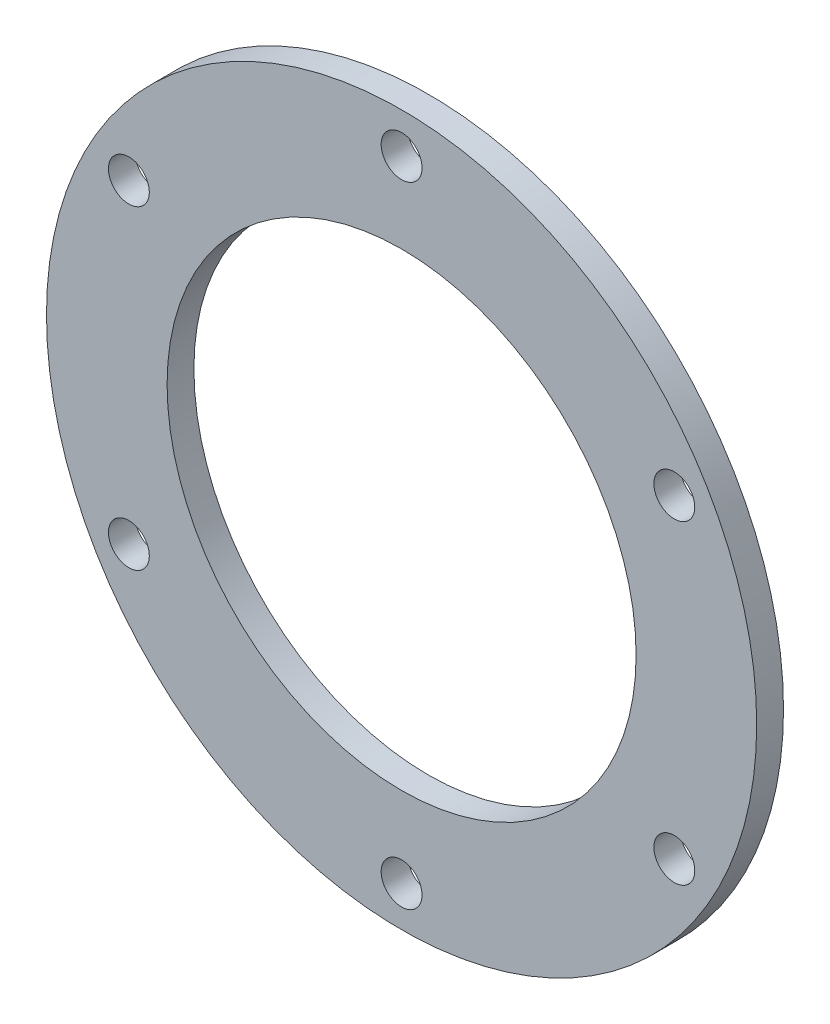
ISO-10303-21;
HEADER;
FILE_DESCRIPTION(('STEP AP214'),'2;1');
FILE_NAME('part.step','',(''),(''),'','','');
FILE_SCHEMA(('AUTOMOTIVE_DESIGN { 1 0 10303 214 1 1 1 1 }'));
ENDSEC;
DATA;
#1=APPLICATION_CONTEXT('core data for automotive mechanical design processes');
#2=APPLICATION_PROTOCOL_DEFINITION('international standard','automotive_design',2000,#1);
#3=PRODUCT_CONTEXT('',#1,'mechanical');
#4=PRODUCT('Part','Part','',(#3));
#5=PRODUCT_RELATED_PRODUCT_CATEGORY('part','',(#4));
#6=PRODUCT_DEFINITION_FORMATION('','',#4);
#7=PRODUCT_DEFINITION_CONTEXT('part definition',#1,'design');
#8=PRODUCT_DEFINITION('design','',#6,#7);
#9=PRODUCT_DEFINITION_SHAPE('','',#8);
#10=(LENGTH_UNIT() NAMED_UNIT(*) SI_UNIT(.MILLI.,.METRE.));
#11=(NAMED_UNIT(*) PLANE_ANGLE_UNIT() SI_UNIT($,.RADIAN.));
#12=(NAMED_UNIT(*) SI_UNIT($,.STERADIAN.) SOLID_ANGLE_UNIT());
#13=UNCERTAINTY_MEASURE_WITH_UNIT(LENGTH_MEASURE(1.E-05),#10,'distance_accuracy_value','');
#14=(GEOMETRIC_REPRESENTATION_CONTEXT(3) GLOBAL_UNCERTAINTY_ASSIGNED_CONTEXT((#13)) GLOBAL_UNIT_ASSIGNED_CONTEXT((#10,
#11,#12)) REPRESENTATION_CONTEXT('',''));
#15=CARTESIAN_POINT('',(0.,0.,0.));
#16=DIRECTION('',(0.,0.,1.));
#17=DIRECTION('',(1.,0.,0.));
#18=AXIS2_PLACEMENT_3D('',#15,#16,#17);
#19=CARTESIAN_POINT('',(0.,0.,2.));
#20=DIRECTION('',(0.,0.,1.));
#21=DIRECTION('',(1.,0.,0.));
#22=AXIS2_PLACEMENT_3D('',#19,#20,#21);
#23=PLANE('',#22);
#24=CARTESIAN_POINT('',(0.,23.5,2.));
#25=DIRECTION('',(0.,0.,1.));
#26=DIRECTION('',(1.,0.,0.));
#27=AXIS2_PLACEMENT_3D('',#24,#25,#26);
#28=CIRCLE('',#27,1.525);
#29=CARTESIAN_POINT('',(1.525,23.5,2.));
#30=VERTEX_POINT('',#29);
#31=EDGE_CURVE('E78',#30,#30,#28,.T.);
#32=ORIENTED_EDGE('',*,*,#31,.F.);
#33=EDGE_LOOP('',(#32));
#34=FACE_BOUND('',#33,.T.);
#35=CARTESIAN_POINT('',(-20.3515969889343,11.75,2.));
#36=DIRECTION('',(0.,0.,1.));
#37=DIRECTION('',(1.,0.,0.));
#38=AXIS2_PLACEMENT_3D('',#35,#36,#37);
#39=CIRCLE('',#38,1.525);
#40=CARTESIAN_POINT('',(-18.8265969889343,11.75,2.));
#41=VERTEX_POINT('',#40);
#42=EDGE_CURVE('E79',#41,#41,#39,.T.);
#43=ORIENTED_EDGE('',*,*,#42,.F.);
#44=EDGE_LOOP('',(#43));
#45=FACE_BOUND('',#44,.T.);
#46=CARTESIAN_POINT('',(-20.3515969889343,-11.75,2.));
#47=DIRECTION('',(0.,0.,1.));
#48=DIRECTION('',(1.,0.,0.));
#49=AXIS2_PLACEMENT_3D('',#46,#47,#48);
#50=CIRCLE('',#49,1.525);
#51=CARTESIAN_POINT('',(-18.8265969889343,-11.75,2.));
#52=VERTEX_POINT('',#51);
#53=EDGE_CURVE('E53',#52,#52,#50,.T.);
#54=ORIENTED_EDGE('',*,*,#53,.F.);
#55=EDGE_LOOP('',(#54));
#56=FACE_BOUND('',#55,.T.);
#57=CARTESIAN_POINT('',(0.,-23.5,2.));
#58=DIRECTION('',(0.,0.,1.));
#59=DIRECTION('',(1.,0.,0.));
#60=AXIS2_PLACEMENT_3D('',#57,#58,#59);
#61=CIRCLE('',#60,1.525);
#62=CARTESIAN_POINT('',(1.525,-23.5,2.));
#63=VERTEX_POINT('',#62);
#64=EDGE_CURVE('E60',#63,#63,#61,.T.);
#65=ORIENTED_EDGE('',*,*,#64,.F.);
#66=EDGE_LOOP('',(#65));
#67=FACE_BOUND('',#66,.T.);
#68=CARTESIAN_POINT('',(20.3515969889343,-11.75,2.));
#69=DIRECTION('',(0.,0.,1.));
#70=DIRECTION('',(1.,0.,0.));
#71=AXIS2_PLACEMENT_3D('',#68,#69,#70);
#72=CIRCLE('',#71,1.525);
#73=CARTESIAN_POINT('',(21.8765969889343,-11.75,2.));
#74=VERTEX_POINT('',#73);
#75=EDGE_CURVE('E66',#74,#74,#72,.T.);
#76=ORIENTED_EDGE('',*,*,#75,.F.);
#77=EDGE_LOOP('',(#76));
#78=FACE_BOUND('',#77,.T.);
#79=CARTESIAN_POINT('',(20.3515969889343,11.75,2.));
#80=DIRECTION('',(0.,0.,1.));
#81=DIRECTION('',(1.,0.,0.));
#82=AXIS2_PLACEMENT_3D('',#79,#80,#81);
#83=CIRCLE('',#82,1.525);
#84=CARTESIAN_POINT('',(21.8765969889343,11.75,2.));
#85=VERTEX_POINT('',#84);
#86=EDGE_CURVE('E72',#85,#85,#83,.T.);
#87=ORIENTED_EDGE('',*,*,#86,.F.);
#88=EDGE_LOOP('',(#87));
#89=FACE_BOUND('',#88,.T.);
#90=CARTESIAN_POINT('',(0.,0.,2.));
#91=DIRECTION('',(0.,0.,1.));
#92=DIRECTION('',(1.,0.,0.));
#93=AXIS2_PLACEMENT_3D('',#90,#91,#92);
#94=CIRCLE('',#93,26.5);
#95=CARTESIAN_POINT('',(26.5,0.,2.));
#96=VERTEX_POINT('',#95);
#97=EDGE_CURVE('E10',#96,#96,#94,.T.);
#98=ORIENTED_EDGE('',*,*,#97,.T.);
#99=EDGE_LOOP('',(#98));
#100=FACE_BOUND('',#99,.T.);
#101=CARTESIAN_POINT('',(0.,0.,2.));
#102=DIRECTION('',(0.,0.,1.));
#103=DIRECTION('',(1.,0.,0.));
#104=AXIS2_PLACEMENT_3D('',#101,#102,#103);
#105=CIRCLE('',#104,17.5);
#106=CARTESIAN_POINT('',(17.5,0.,2.));
#107=VERTEX_POINT('',#106);
#108=EDGE_CURVE('E45',#107,#107,#105,.T.);
#109=ORIENTED_EDGE('',*,*,#108,.F.);
#110=EDGE_LOOP('',(#109));
#111=FACE_BOUND('',#110,.T.);
#112=ADVANCED_FACE('F34',(#34,#45,#56,#67,#78,#89,#100,#111),#23,.T.);
#113=CARTESIAN_POINT('',(0.,0.,0.));
#114=DIRECTION('',(0.,0.,1.));
#115=DIRECTION('',(1.,0.,0.));
#116=AXIS2_PLACEMENT_3D('',#113,#114,#115);
#117=PLANE('',#116);
#118=CARTESIAN_POINT('',(0.,23.5,0.));
#119=DIRECTION('',(0.,0.,1.));
#120=DIRECTION('',(1.,0.,0.));
#121=AXIS2_PLACEMENT_3D('',#118,#119,#120);
#122=CIRCLE('',#121,1.525);
#123=CARTESIAN_POINT('',(1.525,23.5,0.));
#124=VERTEX_POINT('',#123);
#125=EDGE_CURVE('E50',#124,#124,#122,.T.);
#126=ORIENTED_EDGE('',*,*,#125,.T.);
#127=EDGE_LOOP('',(#126));
#128=FACE_BOUND('',#127,.T.);
#129=CARTESIAN_POINT('',(-20.3515969889343,11.75,0.));
#130=DIRECTION('',(0.,0.,1.));
#131=DIRECTION('',(1.,0.,0.));
#132=AXIS2_PLACEMENT_3D('',#129,#130,#131);
#133=CIRCLE('',#132,1.525);
#134=CARTESIAN_POINT('',(-18.8265969889343,11.75,0.));
#135=VERTEX_POINT('',#134);
#136=EDGE_CURVE('E57',#135,#135,#133,.T.);
#137=ORIENTED_EDGE('',*,*,#136,.T.);
#138=EDGE_LOOP('',(#137));
#139=FACE_BOUND('',#138,.T.);
#140=CARTESIAN_POINT('',(-20.3515969889343,-11.75,0.));
#141=DIRECTION('',(0.,0.,1.));
#142=DIRECTION('',(1.,0.,0.));
#143=AXIS2_PLACEMENT_3D('',#140,#141,#142);
#144=CIRCLE('',#143,1.525);
#145=CARTESIAN_POINT('',(-18.8265969889343,-11.75,0.));
#146=VERTEX_POINT('',#145);
#147=EDGE_CURVE('E56',#146,#146,#144,.T.);
#148=ORIENTED_EDGE('',*,*,#147,.T.);
#149=EDGE_LOOP('',(#148));
#150=FACE_BOUND('',#149,.T.);
#151=CARTESIAN_POINT('',(0.,-23.5,0.));
#152=DIRECTION('',(0.,0.,1.));
#153=DIRECTION('',(1.,0.,0.));
#154=AXIS2_PLACEMENT_3D('',#151,#152,#153);
#155=CIRCLE('',#154,1.525);
#156=CARTESIAN_POINT('',(1.525,-23.5,0.));
#157=VERTEX_POINT('',#156);
#158=EDGE_CURVE('E63',#157,#157,#155,.T.);
#159=ORIENTED_EDGE('',*,*,#158,.T.);
#160=EDGE_LOOP('',(#159));
#161=FACE_BOUND('',#160,.T.);
#162=CARTESIAN_POINT('',(20.3515969889343,-11.75,0.));
#163=DIRECTION('',(0.,0.,1.));
#164=DIRECTION('',(1.,0.,0.));
#165=AXIS2_PLACEMENT_3D('',#162,#163,#164);
#166=CIRCLE('',#165,1.525);
#167=CARTESIAN_POINT('',(21.8765969889343,-11.75,0.));
#168=VERTEX_POINT('',#167);
#169=EDGE_CURVE('E69',#168,#168,#166,.T.);
#170=ORIENTED_EDGE('',*,*,#169,.T.);
#171=EDGE_LOOP('',(#170));
#172=FACE_BOUND('',#171,.T.);
#173=CARTESIAN_POINT('',(20.3515969889343,11.75,0.));
#174=DIRECTION('',(0.,0.,1.));
#175=DIRECTION('',(1.,0.,0.));
#176=AXIS2_PLACEMENT_3D('',#173,#174,#175);
#177=CIRCLE('',#176,1.525);
#178=CARTESIAN_POINT('',(21.8765969889343,11.75,0.));
#179=VERTEX_POINT('',#178);
#180=EDGE_CURVE('E75',#179,#179,#177,.T.);
#181=ORIENTED_EDGE('',*,*,#180,.T.);
#182=EDGE_LOOP('',(#181));
#183=FACE_BOUND('',#182,.T.);
#184=CARTESIAN_POINT('',(0.,0.,0.));
#185=DIRECTION('',(0.,0.,1.));
#186=DIRECTION('',(1.,0.,0.));
#187=AXIS2_PLACEMENT_3D('',#184,#185,#186);
#188=CIRCLE('',#187,26.5);
#189=CARTESIAN_POINT('',(26.5,0.,0.));
#190=VERTEX_POINT('',#189);
#191=EDGE_CURVE('E38',#190,#190,#188,.T.);
#192=ORIENTED_EDGE('',*,*,#191,.F.);
#193=EDGE_LOOP('',(#192));
#194=FACE_BOUND('',#193,.T.);
#195=CARTESIAN_POINT('',(0.,0.,0.));
#196=DIRECTION('',(0.,0.,1.));
#197=DIRECTION('',(1.,0.,0.));
#198=AXIS2_PLACEMENT_3D('',#195,#196,#197);
#199=CIRCLE('',#198,17.5);
#200=CARTESIAN_POINT('',(17.5,0.,0.));
#201=VERTEX_POINT('',#200);
#202=EDGE_CURVE('E47',#201,#201,#199,.T.);
#203=ORIENTED_EDGE('',*,*,#202,.T.);
#204=EDGE_LOOP('',(#203));
#205=FACE_BOUND('',#204,.T.);
#206=ADVANCED_FACE('F89',(#128,#139,#150,#161,#172,#183,#194,#205),#117,.F.);
#207=CARTESIAN_POINT('',(0.,0.,2.));
#208=DIRECTION('',(0.,0.,-1.));
#209=DIRECTION('',(-1.,0.,0.));
#210=AXIS2_PLACEMENT_3D('',#207,#208,#209);
#211=CYLINDRICAL_SURFACE('',#210,26.5);
#212=ORIENTED_EDGE('',*,*,#97,.F.);
#213=EDGE_LOOP('',(#212));
#214=FACE_BOUND('',#213,.T.);
#215=ORIENTED_EDGE('',*,*,#191,.T.);
#216=EDGE_LOOP('',(#215));
#217=FACE_BOUND('',#216,.T.);
#218=ADVANCED_FACE('F36',(#214,#217),#211,.T.);
#219=CARTESIAN_POINT('',(0.,0.,2.));
#220=DIRECTION('',(0.,0.,-1.));
#221=DIRECTION('',(-1.,0.,0.));
#222=AXIS2_PLACEMENT_3D('',#219,#220,#221);
#223=CYLINDRICAL_SURFACE('',#222,17.5);
#224=ORIENTED_EDGE('',*,*,#108,.T.);
#225=EDGE_LOOP('',(#224));
#226=FACE_BOUND('',#225,.T.);
#227=ORIENTED_EDGE('',*,*,#202,.F.);
#228=EDGE_LOOP('',(#227));
#229=FACE_BOUND('',#228,.T.);
#230=ADVANCED_FACE('F114',(#226,#229),#223,.F.);
#231=CARTESIAN_POINT('',(20.3515969889343,11.75,0.));
#232=DIRECTION('',(0.,0.,1.));
#233=DIRECTION('',(1.,0.,0.));
#234=AXIS2_PLACEMENT_3D('',#231,#232,#233);
#235=CYLINDRICAL_SURFACE('',#234,1.525);
#236=ORIENTED_EDGE('',*,*,#180,.F.);
#237=EDGE_LOOP('',(#236));
#238=FACE_BOUND('',#237,.T.);
#239=ORIENTED_EDGE('',*,*,#86,.T.);
#240=EDGE_LOOP('',(#239));
#241=FACE_BOUND('',#240,.T.);
#242=ADVANCED_FACE('F117',(#238,#241),#235,.F.);
#243=CARTESIAN_POINT('',(20.3515969889343,-11.75,0.));
#244=DIRECTION('',(0.,0.,1.));
#245=DIRECTION('',(1.,0.,0.));
#246=AXIS2_PLACEMENT_3D('',#243,#244,#245);
#247=CYLINDRICAL_SURFACE('',#246,1.525);
#248=ORIENTED_EDGE('',*,*,#169,.F.);
#249=EDGE_LOOP('',(#248));
#250=FACE_BOUND('',#249,.T.);
#251=ORIENTED_EDGE('',*,*,#75,.T.);
#252=EDGE_LOOP('',(#251));
#253=FACE_BOUND('',#252,.T.);
#254=ADVANCED_FACE('F134',(#250,#253),#247,.F.);
#255=CARTESIAN_POINT('',(0.,-23.5,0.));
#256=DIRECTION('',(0.,0.,1.));
#257=DIRECTION('',(1.,0.,0.));
#258=AXIS2_PLACEMENT_3D('',#255,#256,#257);
#259=CYLINDRICAL_SURFACE('',#258,1.525);
#260=ORIENTED_EDGE('',*,*,#158,.F.);
#261=EDGE_LOOP('',(#260));
#262=FACE_BOUND('',#261,.T.);
#263=ORIENTED_EDGE('',*,*,#64,.T.);
#264=EDGE_LOOP('',(#263));
#265=FACE_BOUND('',#264,.T.);
#266=ADVANCED_FACE('F130',(#262,#265),#259,.F.);
#267=CARTESIAN_POINT('',(-20.3515969889343,-11.75,0.));
#268=DIRECTION('',(0.,0.,1.));
#269=DIRECTION('',(1.,0.,0.));
#270=AXIS2_PLACEMENT_3D('',#267,#268,#269);
#271=CYLINDRICAL_SURFACE('',#270,1.525);
#272=ORIENTED_EDGE('',*,*,#147,.F.);
#273=EDGE_LOOP('',(#272));
#274=FACE_BOUND('',#273,.T.);
#275=ORIENTED_EDGE('',*,*,#53,.T.);
#276=EDGE_LOOP('',(#275));
#277=FACE_BOUND('',#276,.T.);
#278=ADVANCED_FACE('F127',(#274,#277),#271,.F.);
#279=CARTESIAN_POINT('',(-20.3515969889343,11.75,0.));
#280=DIRECTION('',(0.,0.,1.));
#281=DIRECTION('',(1.,0.,0.));
#282=AXIS2_PLACEMENT_3D('',#279,#280,#281);
#283=CYLINDRICAL_SURFACE('',#282,1.525);
#284=ORIENTED_EDGE('',*,*,#136,.F.);
#285=EDGE_LOOP('',(#284));
#286=FACE_BOUND('',#285,.T.);
#287=ORIENTED_EDGE('',*,*,#42,.T.);
#288=EDGE_LOOP('',(#287));
#289=FACE_BOUND('',#288,.T.);
#290=ADVANCED_FACE('F95',(#286,#289),#283,.F.);
#291=CARTESIAN_POINT('',(0.,23.5,0.));
#292=DIRECTION('',(0.,0.,1.));
#293=DIRECTION('',(1.,0.,0.));
#294=AXIS2_PLACEMENT_3D('',#291,#292,#293);
#295=CYLINDRICAL_SURFACE('',#294,1.525);
#296=ORIENTED_EDGE('',*,*,#125,.F.);
#297=EDGE_LOOP('',(#296));
#298=FACE_BOUND('',#297,.T.);
#299=ORIENTED_EDGE('',*,*,#31,.T.);
#300=EDGE_LOOP('',(#299));
#301=FACE_BOUND('',#300,.T.);
#302=ADVANCED_FACE('F92',(#298,#301),#295,.F.);
#303=CLOSED_SHELL('',(#112,#206,#218,#230,#242,#254,#266,#278,#290,#302));
#304=MANIFOLD_SOLID_BREP('B2',#303);
#305=ADVANCED_BREP_SHAPE_REPRESENTATION('',(#18,#304),#14);
#306=SHAPE_DEFINITION_REPRESENTATION(#9,#305);
ENDSEC;
END-ISO-10303-21;
